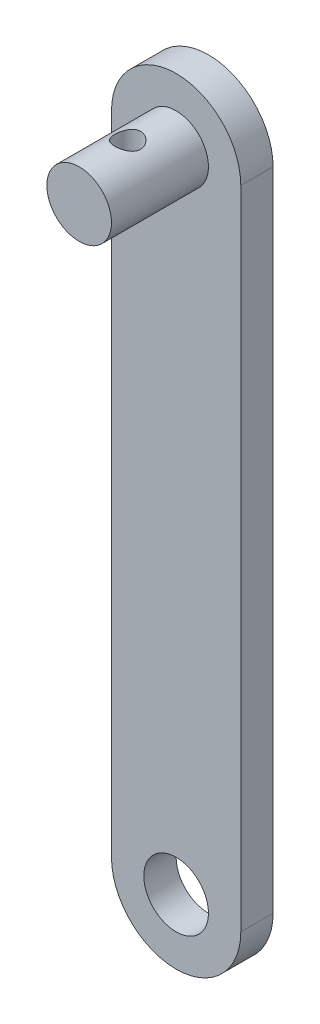
ISO-10303-21;
HEADER;
FILE_DESCRIPTION(('STEP AP214'),'2;1');
FILE_NAME('part.step','',(''),(''),'','','');
FILE_SCHEMA(('AUTOMOTIVE_DESIGN { 1 0 10303 214 1 1 1 1 }'));
ENDSEC;
DATA;
#1=APPLICATION_CONTEXT('core data for automotive mechanical design processes');
#2=APPLICATION_PROTOCOL_DEFINITION('international standard','automotive_design',2000,#1);
#3=PRODUCT_CONTEXT('',#1,'mechanical');
#4=PRODUCT('Part','Part','',(#3));
#5=PRODUCT_RELATED_PRODUCT_CATEGORY('part','',(#4));
#6=PRODUCT_DEFINITION_FORMATION('','',#4);
#7=PRODUCT_DEFINITION_CONTEXT('part definition',#1,'design');
#8=PRODUCT_DEFINITION('design','',#6,#7);
#9=PRODUCT_DEFINITION_SHAPE('','',#8);
#10=(LENGTH_UNIT() NAMED_UNIT(*) SI_UNIT(.MILLI.,.METRE.));
#11=(NAMED_UNIT(*) PLANE_ANGLE_UNIT() SI_UNIT($,.RADIAN.));
#12=(NAMED_UNIT(*) SI_UNIT($,.STERADIAN.) SOLID_ANGLE_UNIT());
#13=UNCERTAINTY_MEASURE_WITH_UNIT(LENGTH_MEASURE(1.E-05),#10,'distance_accuracy_value','');
#14=(GEOMETRIC_REPRESENTATION_CONTEXT(3) GLOBAL_UNCERTAINTY_ASSIGNED_CONTEXT((#13)) GLOBAL_UNIT_ASSIGNED_CONTEXT((#10,
#11,#12)) REPRESENTATION_CONTEXT('',''));
#15=CARTESIAN_POINT('',(0.,0.,0.));
#16=DIRECTION('',(0.,0.,1.));
#17=DIRECTION('',(1.,0.,0.));
#18=AXIS2_PLACEMENT_3D('',#15,#16,#17);
#19=CARTESIAN_POINT('',(0.,63.5,25.4));
#20=DIRECTION('',(0.,0.,-1.));
#21=DIRECTION('',(-1.,0.,0.));
#22=AXIS2_PLACEMENT_3D('',#19,#20,#21);
#23=CYLINDRICAL_SURFACE('',#22,6.35);
#24=CARTESIAN_POINT('',(0.,63.5,25.4));
#25=DIRECTION('',(0.,0.,1.));
#26=DIRECTION('',(1.,0.,0.));
#27=AXIS2_PLACEMENT_3D('',#24,#25,#26);
#28=CIRCLE('',#27,6.35);
#29=CARTESIAN_POINT('',(6.35,63.5,25.4));
#30=VERTEX_POINT('',#29);
#31=EDGE_CURVE('E168',#30,#30,#28,.T.);
#32=ORIENTED_EDGE('',*,*,#31,.F.);
#33=EDGE_LOOP('',(#32));
#34=FACE_BOUND('',#33,.T.);
#35=CARTESIAN_POINT('',(0.,63.5,6.35));
#36=DIRECTION('',(0.,0.,1.));
#37=DIRECTION('',(1.,0.,0.));
#38=AXIS2_PLACEMENT_3D('',#35,#36,#37);
#39=CIRCLE('',#38,6.35);
#40=CARTESIAN_POINT('',(6.35,63.5,6.35));
#41=VERTEX_POINT('',#40);
#42=EDGE_CURVE('E125',#41,#41,#39,.T.);
#43=ORIENTED_EDGE('',*,*,#42,.T.);
#44=EDGE_LOOP('',(#43));
#45=FACE_BOUND('',#44,.T.);
#46=CARTESIAN_POINT('',(0.,57.15,13.335));
#47=CARTESIAN_POINT('',(0.136524206735944,57.1500067537653,13.3350090967706));
#48=CARTESIAN_POINT('',(0.273271326569832,57.1544532912096,13.3460706290327));
#49=CARTESIAN_POINT('',(0.542918354048302,57.1718008185411,13.3899255020854));
#50=CARTESIAN_POINT('',(0.67580677525382,57.1847247905756,13.4227779202305));
#51=CARTESIAN_POINT('',(0.93339206221656,57.2176373635284,13.5088323741441));
#52=CARTESIAN_POINT('',(1.05811419595268,57.2376028200288,13.5619677889683));
#53=CARTESIAN_POINT('',(1.29676124667188,57.2826310910206,13.6868144158289));
#54=CARTESIAN_POINT('',(1.41068989295145,57.307692135432,13.7585191796974));
#55=CARTESIAN_POINT('',(1.63004632396242,57.3616977319218,13.9220390644513));
#56=CARTESIAN_POINT('',(1.7348990980416,57.3907628253185,14.0145854484005));
#57=CARTESIAN_POINT('',(1.92808224416796,57.4489506769739,14.2156180094426));
#58=CARTESIAN_POINT('',(2.01640453280471,57.4780734564434,14.3241119388329));
#59=CARTESIAN_POINT('',(2.17789070386169,57.5345205431251,14.5598236477725));
#60=CARTESIAN_POINT('',(2.25020502702758,57.5617071269639,14.6876598368656));
#61=CARTESIAN_POINT('',(2.37204849226828,57.6093126810088,14.9549312263771));
#62=CARTESIAN_POINT('',(2.42158845640477,57.6297348642726,15.094360880468));
#63=CARTESIAN_POINT('',(2.49415150594019,57.6602052576373,15.374254663566));
#64=CARTESIAN_POINT('',(2.51827533663395,57.670681961465,15.5143850691561));
#65=CARTESIAN_POINT('',(2.54275966122209,57.6813171485947,15.7970664478759));
#66=CARTESIAN_POINT('',(2.54313184070206,57.6814807058657,15.9396161961804));
#67=CARTESIAN_POINT('',(2.52093649674541,57.6718366464396,16.2125109727455));
#68=CARTESIAN_POINT('',(2.49996364917145,57.6627221770105,16.3430149572978));
#69=CARTESIAN_POINT('',(2.43833253797431,57.6367124173817,16.5984676361302));
#70=CARTESIAN_POINT('',(2.39767083940082,57.6198157695151,16.7234153569005));
#71=CARTESIAN_POINT('',(2.29704231034095,57.5797745393753,16.9672226519685));
#72=CARTESIAN_POINT('',(2.23669842514074,57.5565094831339,17.0859059335993));
#73=CARTESIAN_POINT('',(2.09868320512962,57.5063859218485,17.3118980867793));
#74=CARTESIAN_POINT('',(2.02100536247799,57.4795260686981,17.4192026639416));
#75=CARTESIAN_POINT('',(1.84346926130722,57.4227104433731,17.6281203555785));
#76=CARTESIAN_POINT('',(1.74236057797273,57.3926758548029,17.7286522863964));
#77=CARTESIAN_POINT('',(1.52439932283632,57.3346602230298,17.9116792870626));
#78=CARTESIAN_POINT('',(1.40754362297473,57.3066795895444,17.9941707647111));
#79=CARTESIAN_POINT('',(1.15833861880943,57.2552235479402,18.1401941582181));
#80=CARTESIAN_POINT('',(1.02572882401003,57.2318480697882,18.2033192971203));
#81=CARTESIAN_POINT('',(0.750600182163259,57.1929916802248,18.3059931835691));
#82=CARTESIAN_POINT('',(0.608086409999085,57.1775067590278,18.3455539076979));
#83=CARTESIAN_POINT('',(0.326257777261935,57.1569070282622,18.397789335183));
#84=CARTESIAN_POINT('',(0.187252983361637,57.1512325879144,18.411917016902));
#85=CARTESIAN_POINT('',(-0.0912435434559351,57.149130322915,18.4171756376713));
#86=CARTESIAN_POINT('',(-0.23073514079441,57.1527001015049,18.4083125375653));
#87=CARTESIAN_POINT('',(-0.499659578684899,57.1683188982903,18.368909474259));
#88=CARTESIAN_POINT('',(-0.62926276455476,57.1799797299119,18.3393613649543));
#89=CARTESIAN_POINT('',(-0.881551993637283,57.2102050941502,18.2607766504465));
#90=CARTESIAN_POINT('',(-1.0042371459859,57.2287705135721,18.2117375418208));
#91=CARTESIAN_POINT('',(-1.24343005798686,57.2717092464107,18.0939631266065));
#92=CARTESIAN_POINT('',(-1.35963408889802,57.2962428370565,18.0246712505051));
#93=CARTESIAN_POINT('',(-1.57917336088447,57.3484582677318,17.8689757886399));
#94=CARTESIAN_POINT('',(-1.68250341777165,57.3761413674995,17.7825653454885));
#95=CARTESIAN_POINT('',(-1.88051826464125,57.4339070059961,17.5883950835537));
#96=CARTESIAN_POINT('',(-1.97418189591311,57.4640272939023,17.4796024022862));
#97=CARTESIAN_POINT('',(-2.14217402073601,57.521580753952,17.2473110945791));
#98=CARTESIAN_POINT('',(-2.21649932797567,57.5490134828117,17.1238100495719));
#99=CARTESIAN_POINT('',(-2.34417552737538,57.5981283911737,16.8637436478619));
#100=CARTESIAN_POINT('',(-2.39731625476711,57.6197522877693,16.7270633209867));
#101=CARTESIAN_POINT('',(-2.47941619931716,57.6538893468242,16.4455682623354));
#102=CARTESIAN_POINT('',(-2.50839326377964,57.6664092326381,16.300759618669));
#103=CARTESIAN_POINT('',(-2.53963883293423,57.6799486569121,16.0183475646992));
#104=CARTESIAN_POINT('',(-2.54367929088355,57.6817309532725,15.8809755535463));
#105=CARTESIAN_POINT('',(-2.52959001592309,57.6755915823034,15.6076080308743));
#106=CARTESIAN_POINT('',(-2.51146309820303,57.6676711471913,15.4716123467771));
#107=CARTESIAN_POINT('',(-2.45500062199855,57.643691556969,15.2103681182758));
#108=CARTESIAN_POINT('',(-2.41749256915668,57.6279666367898,15.0849072492419));
#109=CARTESIAN_POINT('',(-2.32410696727523,57.5903851833461,14.8420091426196));
#110=CARTESIAN_POINT('',(-2.26822434513928,57.5685269569613,14.7245741317449));
#111=CARTESIAN_POINT('',(-2.13597822075729,57.5195876619585,14.4937357747428));
#112=CARTESIAN_POINT('',(-2.05862525564912,57.4922792096984,14.3809482552866));
#113=CARTESIAN_POINT('',(-1.88708371169555,57.4362096693914,14.1693985208091));
#114=CARTESIAN_POINT('',(-1.79289005847572,57.4074481453894,14.0706405492603));
#115=CARTESIAN_POINT('',(-1.58305912509117,57.3494717580423,13.8833822423316));
#116=CARTESIAN_POINT('',(-1.46642749471675,57.3203484047761,13.7959621049299));
#117=CARTESIAN_POINT('',(-1.21908443861983,57.2668346037328,13.6419124714192));
#118=CARTESIAN_POINT('',(-1.08836650290568,57.2424463590016,13.5752926440916));
#119=CARTESIAN_POINT('',(-0.818776840744577,57.2015664698648,13.4662878940974));
#120=CARTESIAN_POINT('',(-0.6801022938274,57.1849362272416,13.4234747556515));
#121=CARTESIAN_POINT('',(-0.467940499282262,57.1668641339794,13.3774241417858));
#122=CARTESIAN_POINT('',(-0.396594153633359,57.1619869524348,13.3651050527703));
#123=CARTESIAN_POINT('',(-0.253000299869411,57.154637034718,13.3465988989027));
#124=CARTESIAN_POINT('',(-0.180753469322346,57.1521625895991,13.3404074756868));
#125=CARTESIAN_POINT('',(-0.0722838847024092,57.150307704843,13.3357700893125));
#126=CARTESIAN_POINT('',(-0.0361497567762082,57.1499982116946,13.3349975912986));
#127=CARTESIAN_POINT('',(0.,57.15,13.335));
#128=B_SPLINE_CURVE_WITH_KNOTS('',3,(#46,#47,#48,#49,#50,#51,#52,#53,#54,#55,#56,#57,#58,#59,
#60,#61,#62,#63,#64,#65,#66,#67,#68,#69,#70,#71,#72,#73,#74,#75,#76,#77,#78,#79,#80,#81,#82,#83,
#84,#85,#86,#87,#88,#89,#90,#91,#92,#93,#94,#95,#96,#97,#98,#99,#100,#101,#102,#103,#104,#105,
#106,#107,#108,#109,#110,#111,#112,#113,#114,#115,#116,#117,#118,#119,#120,#121,#122,#123,#124,
#125,#126,#127),.UNSPECIFIED.,.T.,.F.,(4,2,2,2,2,2,2,2,2,2,2,2,2,2,2,2,2,2,2,2,2,2,2,2,2,2,2,2,
2,2,2,2,2,2,2,2,2,2,2,2,4),(0.,0.4094517946242,0.820018217730077,1.22924755098891,
1.6383349703134,2.06498674759504,2.49184661566703,2.93770378700405,3.383348873602,
3.80878213742213,4.2340060905242,4.62963677069743,5.0253364981518,5.42911190399496,
5.83303915861492,6.26819103466927,6.7034294790646,7.14726679716764,7.59087834264514,
8.0082286435057,8.42547074834004,8.82396578566744,9.22251202222122,9.63324862015793,
10.0441500856369,10.4821796277301,10.9202812968556,11.3626270732885,11.8046458426034,
12.2148558520879,12.6250137715507,13.0189518455694,13.4129987747255,13.82960744432,
14.2463418571246,14.6900953788797,15.1340548682348,15.5697466228691,15.7872023626933,
16.0045033235398,16.112920600894),.UNSPECIFIED.);
#129=CARTESIAN_POINT('',(0.,57.15,13.335));
#130=VERTEX_POINT('',#129);
#131=EDGE_CURVE('E135',#130,#130,#128,.T.);
#132=ORIENTED_EDGE('',*,*,#131,.F.);
#133=EDGE_LOOP('',(#132));
#134=FACE_BOUND('',#133,.T.);
#135=CARTESIAN_POINT('',(0.,69.85,13.335));
#136=CARTESIAN_POINT('',(-0.136524206735944,69.8499932462347,13.3350090967706));
#137=CARTESIAN_POINT('',(-0.273271326569831,69.8455467087904,13.3460706290327));
#138=CARTESIAN_POINT('',(-0.542918354048301,69.8281991814589,13.3899255020854));
#139=CARTESIAN_POINT('',(-0.675806775253819,69.8152752094244,13.4227779202305));
#140=CARTESIAN_POINT('',(-0.933392062216559,69.7823626364716,13.5088323741441));
#141=CARTESIAN_POINT('',(-1.05811419595267,69.7623971799712,13.5619677889683));
#142=CARTESIAN_POINT('',(-1.29676124667188,69.7173689089794,13.6868144158289));
#143=CARTESIAN_POINT('',(-1.41068989295145,69.692307864568,13.7585191796974));
#144=CARTESIAN_POINT('',(-1.63004632396242,69.6383022680782,13.9220390644513));
#145=CARTESIAN_POINT('',(-1.7348990980416,69.6092371746815,14.0145854484005));
#146=CARTESIAN_POINT('',(-1.92808224416796,69.5510493230261,14.2156180094426));
#147=CARTESIAN_POINT('',(-2.01640453280471,69.5219265435566,14.3241119388329));
#148=CARTESIAN_POINT('',(-2.17789070386169,69.4654794568749,14.5598236477725));
#149=CARTESIAN_POINT('',(-2.25020502702758,69.4382928730361,14.6876598368656));
#150=CARTESIAN_POINT('',(-2.37204849226828,69.3906873189912,14.9549312263771));
#151=CARTESIAN_POINT('',(-2.42158845640477,69.3702651357274,15.094360880468));
#152=CARTESIAN_POINT('',(-2.49415150594019,69.3397947423627,15.374254663566));
#153=CARTESIAN_POINT('',(-2.51827533663395,69.329318038535,15.5143850691561));
#154=CARTESIAN_POINT('',(-2.54275966122209,69.3186828514053,15.7970664478759));
#155=CARTESIAN_POINT('',(-2.54313184070206,69.3185192941343,15.9396161961804));
#156=CARTESIAN_POINT('',(-2.52093649674541,69.3281633535605,16.2125109727455));
#157=CARTESIAN_POINT('',(-2.49996364917145,69.3372778229895,16.3430149572978));
#158=CARTESIAN_POINT('',(-2.43833253797431,69.3632875826183,16.5984676361302));
#159=CARTESIAN_POINT('',(-2.39767083940082,69.3801842304849,16.7234153569005));
#160=CARTESIAN_POINT('',(-2.29704231034095,69.4202254606247,16.9672226519685));
#161=CARTESIAN_POINT('',(-2.23669842514074,69.4434905168661,17.0859059335993));
#162=CARTESIAN_POINT('',(-2.09868320512962,69.4936140781515,17.3118980867793));
#163=CARTESIAN_POINT('',(-2.02100536247799,69.520473931302,17.4192026639416));
#164=CARTESIAN_POINT('',(-1.84346926130722,69.5772895566269,17.6281203555785));
#165=CARTESIAN_POINT('',(-1.74236057797273,69.6073241451971,17.7286522863964));
#166=CARTESIAN_POINT('',(-1.52439932283632,69.6653397769702,17.9116792870626));
#167=CARTESIAN_POINT('',(-1.40754362297472,69.6933204104556,17.9941707647111));
#168=CARTESIAN_POINT('',(-1.15833861880943,69.7447764520598,18.1401941582181));
#169=CARTESIAN_POINT('',(-1.02572882401003,69.7681519302118,18.2033192971203));
#170=CARTESIAN_POINT('',(-0.750600182163256,69.8070083197752,18.3059931835691));
#171=CARTESIAN_POINT('',(-0.608086409999083,69.8224932409722,18.3455539076979));
#172=CARTESIAN_POINT('',(-0.326257777261934,69.8430929717378,18.397789335183));
#173=CARTESIAN_POINT('',(-0.187252983361636,69.8487674120856,18.411917016902));
#174=CARTESIAN_POINT('',(0.0912435434559351,69.850869677085,18.4171756376713));
#175=CARTESIAN_POINT('',(0.23073514079441,69.8472998984951,18.4083125375653));
#176=CARTESIAN_POINT('',(0.499659578684899,69.8316811017097,18.368909474259));
#177=CARTESIAN_POINT('',(0.62926276455476,69.8200202700881,18.3393613649543));
#178=CARTESIAN_POINT('',(0.881551993637283,69.7897949058498,18.2607766504465));
#179=CARTESIAN_POINT('',(1.0042371459859,69.7712294864279,18.2117375418208));
#180=CARTESIAN_POINT('',(1.24343005798685,69.7282907535893,18.0939631266065));
#181=CARTESIAN_POINT('',(1.35963408889802,69.7037571629435,18.0246712505051));
#182=CARTESIAN_POINT('',(1.57917336088447,69.6515417322682,17.8689757886399));
#183=CARTESIAN_POINT('',(1.68250341777165,69.6238586325005,17.7825653454885));
#184=CARTESIAN_POINT('',(1.88051826464125,69.5660929940039,17.5883950835537));
#185=CARTESIAN_POINT('',(1.97418189591311,69.5359727060977,17.4796024022862));
#186=CARTESIAN_POINT('',(2.14217402073601,69.478419246048,17.2473110945791));
#187=CARTESIAN_POINT('',(2.21649932797567,69.4509865171883,17.1238100495719));
#188=CARTESIAN_POINT('',(2.34417552737538,69.4018716088263,16.8637436478619));
#189=CARTESIAN_POINT('',(2.39731625476711,69.3802477122307,16.7270633209867));
#190=CARTESIAN_POINT('',(2.47941619931716,69.3461106531758,16.4455682623354));
#191=CARTESIAN_POINT('',(2.50839326377964,69.333590767362,16.300759618669));
#192=CARTESIAN_POINT('',(2.53963883293423,69.3200513430879,16.0183475646992));
#193=CARTESIAN_POINT('',(2.54367929088355,69.3182690467275,15.8809755535463));
#194=CARTESIAN_POINT('',(2.52959001592309,69.3244084176966,15.6076080308743));
#195=CARTESIAN_POINT('',(2.51146309820303,69.3323288528087,15.4716123467771));
#196=CARTESIAN_POINT('',(2.45500062199855,69.356308443031,15.2103681182758));
#197=CARTESIAN_POINT('',(2.41749256915667,69.3720333632102,15.0849072492419));
#198=CARTESIAN_POINT('',(2.32410696727523,69.4096148166539,14.8420091426196));
#199=CARTESIAN_POINT('',(2.26822434513928,69.4314730430387,14.7245741317449));
#200=CARTESIAN_POINT('',(2.13597822075728,69.4804123380415,14.4937357747428));
#201=CARTESIAN_POINT('',(2.05862525564912,69.5077207903016,14.3809482552866));
#202=CARTESIAN_POINT('',(1.88708371169555,69.5637903306086,14.1693985208091));
#203=CARTESIAN_POINT('',(1.79289005847572,69.5925518546105,14.0706405492603));
#204=CARTESIAN_POINT('',(1.58305912509117,69.6505282419577,13.8833822423316));
#205=CARTESIAN_POINT('',(1.46642749471675,69.6796515952239,13.7959621049299));
#206=CARTESIAN_POINT('',(1.21908443861983,69.7331653962672,13.6419124714192));
#207=CARTESIAN_POINT('',(1.08836650290568,69.7575536409984,13.5752926440916));
#208=CARTESIAN_POINT('',(0.818776840744574,69.7984335301352,13.4662878940974));
#209=CARTESIAN_POINT('',(0.680102293827399,69.8150637727584,13.4234747556515));
#210=CARTESIAN_POINT('',(0.467940499282261,69.8331358660206,13.3774241417858));
#211=CARTESIAN_POINT('',(0.396594153633358,69.8380130475652,13.3651050527703));
#212=CARTESIAN_POINT('',(0.253000299869411,69.845362965282,13.3465988989027));
#213=CARTESIAN_POINT('',(0.180753469322346,69.8478374104009,13.3404074756868));
#214=CARTESIAN_POINT('',(0.0722838847024093,69.849692295157,13.3357700893125));
#215=CARTESIAN_POINT('',(0.0361497567762083,69.8500017883054,13.3349975912986));
#216=CARTESIAN_POINT('',(0.,69.85,13.335));
#217=B_SPLINE_CURVE_WITH_KNOTS('',3,(#135,#136,#137,#138,#139,#140,#141,#142,#143,#144,#145,
#146,#147,#148,#149,#150,#151,#152,#153,#154,#155,#156,#157,#158,#159,#160,#161,#162,#163,#164,
#165,#166,#167,#168,#169,#170,#171,#172,#173,#174,#175,#176,#177,#178,#179,#180,#181,#182,#183,
#184,#185,#186,#187,#188,#189,#190,#191,#192,#193,#194,#195,#196,#197,#198,#199,#200,#201,#202,
#203,#204,#205,#206,#207,#208,#209,#210,#211,#212,#213,#214,#215,#216),.UNSPECIFIED.,.T.,.F.,(4,
2,2,2,2,2,2,2,2,2,2,2,2,2,2,2,2,2,2,2,2,2,2,2,2,2,2,2,2,2,2,2,2,2,2,2,2,2,2,2,4),(0.,
0.409451794624199,0.820018217730076,1.22924755098891,1.6383349703134,2.06498674759504,
2.49184661566702,2.93770378700405,3.38334887360201,3.80878213742212,4.23400609052419,
4.62963677069742,5.0253364981518,5.42911190399496,5.83303915861493,6.26819103466927,
6.7034294790646,7.14726679716764,7.59087834264514,8.00822864350569,8.42547074834004,
8.82396578566744,9.22251202222121,9.63324862015793,10.0441500856369,10.4821796277301,
10.9202812968556,11.3626270732885,11.8046458426034,12.2148558520879,12.6250137715507,
13.0189518455694,13.4129987747256,13.82960744432,14.2463418571246,14.6900953788797,
15.1340548682348,15.5697466228691,15.7872023626933,16.0045033235398,16.112920600894),.UNSPECIFIED.);
#218=CARTESIAN_POINT('',(0.,69.85,13.335));
#219=VERTEX_POINT('',#218);
#220=EDGE_CURVE('E47',#219,#219,#217,.T.);
#221=ORIENTED_EDGE('',*,*,#220,.F.);
#222=EDGE_LOOP('',(#221));
#223=FACE_BOUND('',#222,.T.);
#224=ADVANCED_FACE('F43',(#34,#45,#134,#223),#23,.T.);
#225=CARTESIAN_POINT('',(0.,63.5,6.35));
#226=DIRECTION('',(0.,0.,-1.));
#227=DIRECTION('',(-1.,0.,0.));
#228=AXIS2_PLACEMENT_3D('',#225,#226,#227);
#229=PLANE('',#228);
#230=CARTESIAN_POINT('',(0.,63.5,6.35));
#231=DIRECTION('',(0.,0.,1.));
#232=DIRECTION('',(-1.,0.,0.));
#233=AXIS2_PLACEMENT_3D('',#230,#231,#232);
#234=CIRCLE('',#233,12.7);
#235=CARTESIAN_POINT('',(12.7,63.5,6.35));
#236=VERTEX_POINT('',#235);
#237=CARTESIAN_POINT('',(-12.7,63.5,6.35));
#238=VERTEX_POINT('',#237);
#239=EDGE_CURVE('E104',#236,#238,#234,.T.);
#240=ORIENTED_EDGE('',*,*,#239,.T.);
#241=DIRECTION('',(0.,-1.,0.));
#242=VECTOR('',#241,1.);
#243=CARTESIAN_POINT('',(-12.7,-63.5,6.35));
#244=LINE('',#243,#242);
#245=CARTESIAN_POINT('',(-12.7,-63.5,6.35));
#246=VERTEX_POINT('',#245);
#247=EDGE_CURVE('E98',#238,#246,#244,.T.);
#248=ORIENTED_EDGE('',*,*,#247,.T.);
#249=CARTESIAN_POINT('',(0.,-63.5,6.35));
#250=DIRECTION('',(0.,0.,1.));
#251=DIRECTION('',(1.,0.,0.));
#252=AXIS2_PLACEMENT_3D('',#249,#250,#251);
#253=CIRCLE('',#252,12.7);
#254=CARTESIAN_POINT('',(12.7,-63.5,6.35));
#255=VERTEX_POINT('',#254);
#256=EDGE_CURVE('E102',#246,#255,#253,.T.);
#257=ORIENTED_EDGE('',*,*,#256,.T.);
#258=DIRECTION('',(0.,1.,0.));
#259=VECTOR('',#258,1.);
#260=CARTESIAN_POINT('',(12.7,-63.5,6.35));
#261=LINE('',#260,#259);
#262=EDGE_CURVE('E68',#255,#236,#261,.T.);
#263=ORIENTED_EDGE('',*,*,#262,.T.);
#264=EDGE_LOOP('',(#240,#248,#257,#263));
#265=FACE_BOUND('',#264,.T.);
#266=ORIENTED_EDGE('',*,*,#42,.F.);
#267=EDGE_LOOP('',(#266));
#268=FACE_BOUND('',#267,.T.);
#269=CARTESIAN_POINT('',(0.,-63.5,6.35));
#270=DIRECTION('',(0.,0.,1.));
#271=DIRECTION('',(-1.,0.,0.));
#272=AXIS2_PLACEMENT_3D('',#269,#270,#271);
#273=CIRCLE('',#272,6.35);
#274=CARTESIAN_POINT('',(-6.35,-63.5,6.35));
#275=VERTEX_POINT('',#274);
#276=EDGE_CURVE('E183',#275,#275,#273,.T.);
#277=ORIENTED_EDGE('',*,*,#276,.F.);
#278=EDGE_LOOP('',(#277));
#279=FACE_BOUND('',#278,.T.);
#280=ADVANCED_FACE('F99',(#265,#268,#279),#229,.F.);
#281=CARTESIAN_POINT('',(0.,63.5,0.));
#282=DIRECTION('',(0.,0.,-1.));
#283=DIRECTION('',(-1.,0.,0.));
#284=AXIS2_PLACEMENT_3D('',#281,#282,#283);
#285=PLANE('',#284);
#286=CARTESIAN_POINT('',(0.,63.5,0.));
#287=DIRECTION('',(0.,0.,1.));
#288=DIRECTION('',(-1.,0.,0.));
#289=AXIS2_PLACEMENT_3D('',#286,#287,#288);
#290=CIRCLE('',#289,12.7);
#291=CARTESIAN_POINT('',(12.7,63.5,0.));
#292=VERTEX_POINT('',#291);
#293=CARTESIAN_POINT('',(-12.7,63.5,0.));
#294=VERTEX_POINT('',#293);
#295=EDGE_CURVE('E121',#292,#294,#290,.T.);
#296=ORIENTED_EDGE('',*,*,#295,.F.);
#297=DIRECTION('',(0.,1.,0.));
#298=VECTOR('',#297,1.);
#299=CARTESIAN_POINT('',(12.7,-63.5,0.));
#300=LINE('',#299,#298);
#301=CARTESIAN_POINT('',(12.7,-63.5,0.));
#302=VERTEX_POINT('',#301);
#303=EDGE_CURVE('E91',#302,#292,#300,.T.);
#304=ORIENTED_EDGE('',*,*,#303,.F.);
#305=CARTESIAN_POINT('',(0.,-63.5,0.));
#306=DIRECTION('',(0.,0.,1.));
#307=DIRECTION('',(1.,0.,0.));
#308=AXIS2_PLACEMENT_3D('',#305,#306,#307);
#309=CIRCLE('',#308,12.7);
#310=CARTESIAN_POINT('',(-12.7,-63.5,0.));
#311=VERTEX_POINT('',#310);
#312=EDGE_CURVE('E85',#311,#302,#309,.T.);
#313=ORIENTED_EDGE('',*,*,#312,.F.);
#314=DIRECTION('',(0.,-1.,0.));
#315=VECTOR('',#314,1.);
#316=CARTESIAN_POINT('',(-12.7,-63.5,0.));
#317=LINE('',#316,#315);
#318=EDGE_CURVE('E109',#294,#311,#317,.T.);
#319=ORIENTED_EDGE('',*,*,#318,.F.);
#320=EDGE_LOOP('',(#296,#304,#313,#319));
#321=FACE_BOUND('',#320,.T.);
#322=CARTESIAN_POINT('',(0.,-63.5,0.));
#323=DIRECTION('',(0.,0.,1.));
#324=DIRECTION('',(-1.,0.,0.));
#325=AXIS2_PLACEMENT_3D('',#322,#323,#324);
#326=CIRCLE('',#325,6.35);
#327=CARTESIAN_POINT('',(-6.35,-63.5,0.));
#328=VERTEX_POINT('',#327);
#329=EDGE_CURVE('E179',#328,#328,#326,.T.);
#330=ORIENTED_EDGE('',*,*,#329,.T.);
#331=EDGE_LOOP('',(#330));
#332=FACE_BOUND('',#331,.T.);
#333=ADVANCED_FACE('F164',(#321,#332),#285,.T.);
#334=CARTESIAN_POINT('',(0.,63.5,6.35));
#335=DIRECTION('',(0.,0.,-1.));
#336=DIRECTION('',(-1.,0.,0.));
#337=AXIS2_PLACEMENT_3D('',#334,#335,#336);
#338=CYLINDRICAL_SURFACE('',#337,12.7);
#339=ORIENTED_EDGE('',*,*,#295,.T.);
#340=DIRECTION('',(0.,0.,-1.));
#341=VECTOR('',#340,1.);
#342=CARTESIAN_POINT('',(-12.7,63.5,6.35));
#343=LINE('',#342,#341);
#344=EDGE_CURVE('E11',#238,#294,#343,.T.);
#345=ORIENTED_EDGE('',*,*,#344,.F.);
#346=ORIENTED_EDGE('',*,*,#239,.F.);
#347=DIRECTION('',(0.,0.,-1.));
#348=VECTOR('',#347,1.);
#349=CARTESIAN_POINT('',(12.7,63.5,6.35));
#350=LINE('',#349,#348);
#351=EDGE_CURVE('E117',#236,#292,#350,.T.);
#352=ORIENTED_EDGE('',*,*,#351,.T.);
#353=EDGE_LOOP('',(#339,#345,#346,#352));
#354=FACE_BOUND('',#353,.T.);
#355=ADVANCED_FACE('F45',(#354),#338,.T.);
#356=CARTESIAN_POINT('',(-12.7,-63.5,6.35));
#357=DIRECTION('',(1.,0.,0.));
#358=DIRECTION('',(0.,0.,-1.));
#359=AXIS2_PLACEMENT_3D('',#356,#357,#358);
#360=PLANE('',#359);
#361=ORIENTED_EDGE('',*,*,#318,.T.);
#362=DIRECTION('',(0.,0.,-1.));
#363=VECTOR('',#362,1.);
#364=CARTESIAN_POINT('',(-12.7,-63.5,6.35));
#365=LINE('',#364,#363);
#366=EDGE_CURVE('E59',#246,#311,#365,.T.);
#367=ORIENTED_EDGE('',*,*,#366,.F.);
#368=ORIENTED_EDGE('',*,*,#247,.F.);
#369=ORIENTED_EDGE('',*,*,#344,.T.);
#370=EDGE_LOOP('',(#361,#367,#368,#369));
#371=FACE_BOUND('',#370,.T.);
#372=ADVANCED_FACE('F108',(#371),#360,.F.);
#373=CARTESIAN_POINT('',(0.,-63.5,6.35));
#374=DIRECTION('',(0.,0.,-1.));
#375=DIRECTION('',(-1.,0.,0.));
#376=AXIS2_PLACEMENT_3D('',#373,#374,#375);
#377=CYLINDRICAL_SURFACE('',#376,12.7);
#378=ORIENTED_EDGE('',*,*,#312,.T.);
#379=DIRECTION('',(0.,0.,-1.));
#380=VECTOR('',#379,1.);
#381=CARTESIAN_POINT('',(12.7,-63.5,6.35));
#382=LINE('',#381,#380);
#383=EDGE_CURVE('E111',#255,#302,#382,.T.);
#384=ORIENTED_EDGE('',*,*,#383,.F.);
#385=ORIENTED_EDGE('',*,*,#256,.F.);
#386=ORIENTED_EDGE('',*,*,#366,.T.);
#387=EDGE_LOOP('',(#378,#384,#385,#386));
#388=FACE_BOUND('',#387,.T.);
#389=ADVANCED_FACE('F113',(#388),#377,.T.);
#390=CARTESIAN_POINT('',(12.7,-63.5,6.35));
#391=DIRECTION('',(-1.,0.,0.));
#392=DIRECTION('',(0.,0.,1.));
#393=AXIS2_PLACEMENT_3D('',#390,#391,#392);
#394=PLANE('',#393);
#395=ORIENTED_EDGE('',*,*,#303,.T.);
#396=ORIENTED_EDGE('',*,*,#351,.F.);
#397=ORIENTED_EDGE('',*,*,#262,.F.);
#398=ORIENTED_EDGE('',*,*,#383,.T.);
#399=EDGE_LOOP('',(#395,#396,#397,#398));
#400=FACE_BOUND('',#399,.T.);
#401=ADVANCED_FACE('F156',(#400),#394,.F.);
#402=CARTESIAN_POINT('',(0.,-63.5,6.35));
#403=DIRECTION('',(0.,0.,-1.));
#404=DIRECTION('',(-1.,0.,0.));
#405=AXIS2_PLACEMENT_3D('',#402,#403,#404);
#406=CYLINDRICAL_SURFACE('',#405,6.35);
#407=ORIENTED_EDGE('',*,*,#276,.T.);
#408=EDGE_LOOP('',(#407));
#409=FACE_BOUND('',#408,.T.);
#410=ORIENTED_EDGE('',*,*,#329,.F.);
#411=EDGE_LOOP('',(#410));
#412=FACE_BOUND('',#411,.T.);
#413=ADVANCED_FACE('F151',(#409,#412),#406,.F.);
#414=CARTESIAN_POINT('',(0.,63.5,25.4));
#415=DIRECTION('',(0.,0.,1.));
#416=DIRECTION('',(1.,0.,0.));
#417=AXIS2_PLACEMENT_3D('',#414,#415,#416);
#418=PLANE('',#417);
#419=ORIENTED_EDGE('',*,*,#31,.T.);
#420=EDGE_LOOP('',(#419));
#421=FACE_BOUND('',#420,.T.);
#422=ADVANCED_FACE('F147',(#421),#418,.T.);
#423=CARTESIAN_POINT('',(0.,76.2,15.875));
#424=DIRECTION('',(0.,-1.,0.));
#425=DIRECTION('',(0.,0.,-1.));
#426=AXIS2_PLACEMENT_3D('',#423,#424,#425);
#427=CYLINDRICAL_SURFACE('',#426,2.54);
#428=ORIENTED_EDGE('',*,*,#131,.T.);
#429=EDGE_LOOP('',(#428));
#430=FACE_BOUND('',#429,.T.);
#431=ORIENTED_EDGE('',*,*,#220,.T.);
#432=EDGE_LOOP('',(#431));
#433=FACE_BOUND('',#432,.T.);
#434=ADVANCED_FACE('F144',(#430,#433),#427,.F.);
#435=CLOSED_SHELL('',(#224,#280,#333,#355,#372,#389,#401,#413,#422,#434));
#436=MANIFOLD_SOLID_BREP('B2',#435);
#437=ADVANCED_BREP_SHAPE_REPRESENTATION('',(#18,#436),#14);
#438=SHAPE_DEFINITION_REPRESENTATION(#9,#437);
ENDSEC;
END-ISO-10303-21;
